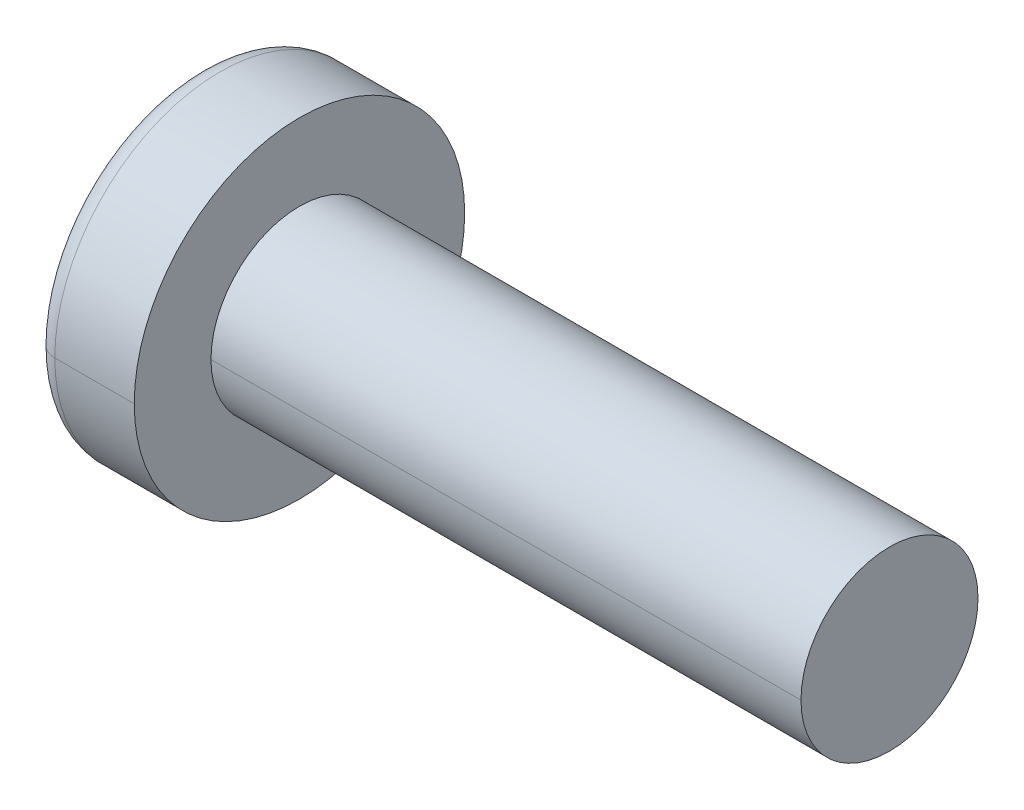
ISO-10303-21;
HEADER;
FILE_DESCRIPTION(('STEP AP214'),'2;1');
FILE_NAME('part.step','',(''),(''),'','','');
FILE_SCHEMA(('AUTOMOTIVE_DESIGN { 1 0 10303 214 1 1 1 1 }'));
ENDSEC;
DATA;
#1=APPLICATION_CONTEXT('core data for automotive mechanical design processes');
#2=APPLICATION_PROTOCOL_DEFINITION('international standard','automotive_design',2000,#1);
#3=PRODUCT_CONTEXT('',#1,'mechanical');
#4=PRODUCT('Part','Part','',(#3));
#5=PRODUCT_RELATED_PRODUCT_CATEGORY('part','',(#4));
#6=PRODUCT_DEFINITION_FORMATION('','',#4);
#7=PRODUCT_DEFINITION_CONTEXT('part definition',#1,'design');
#8=PRODUCT_DEFINITION('design','',#6,#7);
#9=PRODUCT_DEFINITION_SHAPE('','',#8);
#10=(LENGTH_UNIT() NAMED_UNIT(*) SI_UNIT(.MILLI.,.METRE.));
#11=(NAMED_UNIT(*) PLANE_ANGLE_UNIT() SI_UNIT($,.RADIAN.));
#12=(NAMED_UNIT(*) SI_UNIT($,.STERADIAN.) SOLID_ANGLE_UNIT());
#13=UNCERTAINTY_MEASURE_WITH_UNIT(LENGTH_MEASURE(1.E-05),#10,'distance_accuracy_value','');
#14=(GEOMETRIC_REPRESENTATION_CONTEXT(3) GLOBAL_UNCERTAINTY_ASSIGNED_CONTEXT((#13)) GLOBAL_UNIT_ASSIGNED_CONTEXT((#10,
#11,#12)) REPRESENTATION_CONTEXT('',''));
#15=CARTESIAN_POINT('',(0.,0.,0.));
#16=DIRECTION('',(0.,0.,1.));
#17=DIRECTION('',(1.,0.,0.));
#18=AXIS2_PLACEMENT_3D('',#15,#16,#17);
#19=CARTESIAN_POINT('',(1.05335585592012,0.,0.));
#20=DIRECTION('',(-1.,0.,0.));
#21=DIRECTION('',(0.,0.,1.));
#22=AXIS2_PLACEMENT_3D('',#19,#20,#21);
#23=TOROIDAL_SURFACE('',#22,2.44,0.36);
#24=CARTESIAN_POINT('',(1.05335585592012,0.,0.));
#25=DIRECTION('',(-1.,0.,0.));
#26=DIRECTION('',(0.,0.,1.));
#27=AXIS2_PLACEMENT_3D('',#24,#25,#26);
#28=CIRCLE('',#27,2.79999999999986);
#29=CARTESIAN_POINT('',(1.05335585592012,0.,2.79999999999986));
#30=VERTEX_POINT('',#29);
#31=CARTESIAN_POINT('',(1.05335585592012,0.,-2.8));
#32=VERTEX_POINT('',#31);
#33=EDGE_CURVE('E11',#30,#32,#28,.T.);
#34=ORIENTED_EDGE('',*,*,#33,.T.);
#35=CARTESIAN_POINT('',(1.05335585592012,0.,-2.43999999999988));
#36=DIRECTION('',(0.,1.,0.));
#37=DIRECTION('',(0.,0.,1.));
#38=AXIS2_PLACEMENT_3D('',#35,#36,#37);
#39=CIRCLE('',#38,0.36);
#40=CARTESIAN_POINT('',(0.747150706810473,0.,-2.62931034482761));
#41=VERTEX_POINT('',#40);
#42=EDGE_CURVE('E28',#32,#41,#39,.T.);
#43=ORIENTED_EDGE('',*,*,#42,.T.);
#44=CARTESIAN_POINT('',(0.747150706810473,0.,0.));
#45=DIRECTION('',(-1.,0.,0.));
#46=DIRECTION('',(0.,0.,1.));
#47=AXIS2_PLACEMENT_3D('',#44,#45,#46);
#48=CIRCLE('',#47,2.62931034482745);
#49=CARTESIAN_POINT('',(0.747150706810473,2.62931034482726,0.));
#50=VERTEX_POINT('',#49);
#51=EDGE_CURVE('E256',#50,#41,#48,.T.);
#52=ORIENTED_EDGE('',*,*,#51,.F.);
#53=CARTESIAN_POINT('',(0.747150706810473,0.,0.));
#54=DIRECTION('',(-1.,0.,0.));
#55=DIRECTION('',(0.,0.,1.));
#56=AXIS2_PLACEMENT_3D('',#53,#54,#55);
#57=CIRCLE('',#56,2.62931034482745);
#58=CARTESIAN_POINT('',(0.747150706810473,0.,2.62931034482756));
#59=VERTEX_POINT('',#58);
#60=EDGE_CURVE('E174',#59,#50,#57,.T.);
#61=ORIENTED_EDGE('',*,*,#60,.F.);
#62=CARTESIAN_POINT('',(1.05335585592012,0.,2.43999999999988));
#63=DIRECTION('',(0.,-1.,0.));
#64=DIRECTION('',(0.,0.,-1.));
#65=AXIS2_PLACEMENT_3D('',#62,#63,#64);
#66=CIRCLE('',#65,0.36);
#67=EDGE_CURVE('E168',#30,#59,#66,.T.);
#68=ORIENTED_EDGE('',*,*,#67,.F.);
#69=EDGE_LOOP('',(#34,#43,#52,#61,#68));
#70=FACE_BOUND('',#69,.T.);
#71=ADVANCED_FACE('F17',(#70),#23,.T.);
#72=CARTESIAN_POINT('',(-25.4,0.,0.));
#73=DIRECTION('',(-1.,0.,0.));
#74=DIRECTION('',(0.,0.,1.));
#75=AXIS2_PLACEMENT_3D('',#72,#73,#74);
#76=CYLINDRICAL_SURFACE('',#75,2.79999999999986);
#77=CARTESIAN_POINT('',(2.4,0.,0.));
#78=DIRECTION('',(-1.,0.,0.));
#79=DIRECTION('',(0.,0.,1.));
#80=AXIS2_PLACEMENT_3D('',#77,#78,#79);
#81=CIRCLE('',#80,2.79999999999986);
#82=CARTESIAN_POINT('',(2.4,0.,2.79999999999986));
#83=VERTEX_POINT('',#82);
#84=CARTESIAN_POINT('',(2.4,0.,-2.8));
#85=VERTEX_POINT('',#84);
#86=EDGE_CURVE('E291',#83,#85,#81,.T.);
#87=ORIENTED_EDGE('',*,*,#86,.T.);
#88=DIRECTION('',(-1.,0.,0.));
#89=VECTOR('',#88,1.);
#90=CARTESIAN_POINT('',(-25.4,0.,-2.79999999999989));
#91=LINE('',#90,#89);
#92=EDGE_CURVE('E43',#85,#32,#91,.T.);
#93=ORIENTED_EDGE('',*,*,#92,.T.);
#94=ORIENTED_EDGE('',*,*,#33,.F.);
#95=DIRECTION('',(-1.,0.,0.));
#96=VECTOR('',#95,1.);
#97=CARTESIAN_POINT('',(-25.4,0.,2.79999999999984));
#98=LINE('',#97,#96);
#99=EDGE_CURVE('E185',#83,#30,#98,.T.);
#100=ORIENTED_EDGE('',*,*,#99,.F.);
#101=EDGE_LOOP('',(#87,#93,#94,#100));
#102=FACE_BOUND('',#101,.T.);
#103=ADVANCED_FACE('F192',(#102),#76,.T.);
#104=CARTESIAN_POINT('',(-25.4,0.,0.));
#105=DIRECTION('',(-1.,0.,0.));
#106=DIRECTION('',(0.,0.,1.));
#107=AXIS2_PLACEMENT_3D('',#104,#105,#106);
#108=CYLINDRICAL_SURFACE('',#107,1.49999999999993);
#109=CARTESIAN_POINT('',(12.4,0.,0.));
#110=DIRECTION('',(-1.,0.,0.));
#111=DIRECTION('',(0.,0.,1.));
#112=AXIS2_PLACEMENT_3D('',#109,#110,#111);
#113=CIRCLE('',#112,1.49999999999993);
#114=CARTESIAN_POINT('',(12.4,0.,1.49999999999994));
#115=VERTEX_POINT('',#114);
#116=CARTESIAN_POINT('',(12.4,0.,-1.49999999999998));
#117=VERTEX_POINT('',#116);
#118=EDGE_CURVE('E232',#115,#117,#113,.T.);
#119=ORIENTED_EDGE('',*,*,#118,.T.);
#120=DIRECTION('',(-1.,0.,0.));
#121=VECTOR('',#120,1.);
#122=CARTESIAN_POINT('',(-25.4,0.,-1.49999999999995));
#123=LINE('',#122,#121);
#124=CARTESIAN_POINT('',(2.4,0.,-1.5));
#125=VERTEX_POINT('',#124);
#126=EDGE_CURVE('E236',#117,#125,#123,.T.);
#127=ORIENTED_EDGE('',*,*,#126,.T.);
#128=CARTESIAN_POINT('',(2.4,0.,0.));
#129=DIRECTION('',(-1.,0.,0.));
#130=DIRECTION('',(0.,0.,1.));
#131=AXIS2_PLACEMENT_3D('',#128,#129,#130);
#132=CIRCLE('',#131,1.49999999999993);
#133=CARTESIAN_POINT('',(2.4,0.,1.49999999999992));
#134=VERTEX_POINT('',#133);
#135=EDGE_CURVE('E333',#134,#125,#132,.T.);
#136=ORIENTED_EDGE('',*,*,#135,.F.);
#137=DIRECTION('',(-1.,0.,0.));
#138=VECTOR('',#137,1.);
#139=CARTESIAN_POINT('',(-25.4,0.,1.4999999999999));
#140=LINE('',#139,#138);
#141=EDGE_CURVE('E329',#115,#134,#140,.T.);
#142=ORIENTED_EDGE('',*,*,#141,.F.);
#143=EDGE_LOOP('',(#119,#127,#136,#142));
#144=FACE_BOUND('',#143,.T.);
#145=ADVANCED_FACE('F482',(#144),#108,.T.);
#146=CARTESIAN_POINT('',(5.,0.,0.));
#147=DIRECTION('',(1.,0.,0.));
#148=DIRECTION('',(0.,1.,0.));
#149=AXIS2_PLACEMENT_3D('',#146,#147,#148);
#150=SPHERICAL_SURFACE('',#149,5.);
#151=ORIENTED_EDGE('',*,*,#51,.T.);
#152=CARTESIAN_POINT('',(0.747150706810473,0.,0.));
#153=DIRECTION('',(-1.,0.,0.));
#154=DIRECTION('',(0.,0.,1.));
#155=AXIS2_PLACEMENT_3D('',#152,#153,#154);
#156=CIRCLE('',#155,2.62931034482745);
#157=CARTESIAN_POINT('',(0.747150706810473,-2.62931034482743,0.));
#158=VERTEX_POINT('',#157);
#159=EDGE_CURVE('E214',#41,#158,#156,.T.);
#160=ORIENTED_EDGE('',*,*,#159,.T.);
#161=CARTESIAN_POINT('',(5.,0.,0.));
#162=DIRECTION('',(0.,0.,-1.));
#163=DIRECTION('',(0.,1.,0.));
#164=AXIS2_PLACEMENT_3D('',#161,#162,#163);
#165=CIRCLE('',#164,5.);
#166=CARTESIAN_POINT('',(0.177959569922061,-1.3220915591186,0.));
#167=VERTEX_POINT('',#166);
#168=EDGE_CURVE('E210',#158,#167,#165,.T.);
#169=ORIENTED_EDGE('',*,*,#168,.T.);
#170=CARTESIAN_POINT('',(3.98403090792016,1.41352221506753,0.));
#171=DIRECTION('',(0.583636048152556,-0.812015371342727,0.));
#172=DIRECTION('',(0.812015371342727,0.583636048152556,0.));
#173=AXIS2_PLACEMENT_3D('',#170,#171,#172);
#174=CIRCLE('',#173,4.68719124331919);
#175=CARTESIAN_POINT('',(0.188596138461464,-1.31444652548077,-0.35017597408216));
#176=VERTEX_POINT('',#175);
#177=EDGE_CURVE('E215',#167,#176,#174,.T.);
#178=ORIENTED_EDGE('',*,*,#177,.T.);
#179=CARTESIAN_POINT('',(4.98382636322273,0.,0.153868112043296));
#180=DIRECTION('',(-0.104537710696282,0.,0.994520923380891));
#181=DIRECTION('',(0.994520923380891,0.,0.104537710696282));
#182=AXIS2_PLACEMENT_3D('',#179,#180,#181);
#183=CIRCLE('',#182,4.99760572850336);
#184=CARTESIAN_POINT('',(0.0270341343314024,-0.367158343834467,-0.367158343834471));
#185=VERTEX_POINT('',#184);
#186=EDGE_CURVE('E284',#185,#176,#183,.T.);
#187=ORIENTED_EDGE('',*,*,#186,.F.);
#188=CARTESIAN_POINT('',(4.98382636322273,0.153868112043244,0.));
#189=DIRECTION('',(-0.104537710696282,0.994520923380891,0.));
#190=DIRECTION('',(-0.994520923380891,-0.104537710696282,0.));
#191=AXIS2_PLACEMENT_3D('',#188,#189,#190);
#192=CIRCLE('',#191,4.99760572850336);
#193=CARTESIAN_POINT('',(0.188596138461603,-0.350175974082205,-1.31444652548067));
#194=VERTEX_POINT('',#193);
#195=EDGE_CURVE('E73',#194,#185,#192,.T.);
#196=ORIENTED_EDGE('',*,*,#195,.F.);
#197=CARTESIAN_POINT('',(3.98403090792012,0.,1.41352221506755));
#198=DIRECTION('',(0.583636048152557,0.,-0.812015371342727));
#199=DIRECTION('',(-0.812015371342727,0.,-0.583636048152557));
#200=AXIS2_PLACEMENT_3D('',#197,#198,#199);
#201=CIRCLE('',#200,4.68719124331919);
#202=CARTESIAN_POINT('',(0.188596138461603,0.350175974082108,-1.31444652548074));
#203=VERTEX_POINT('',#202);
#204=EDGE_CURVE('E216',#194,#203,#201,.T.);
#205=ORIENTED_EDGE('',*,*,#204,.T.);
#206=CARTESIAN_POINT('',(4.98382636322273,-0.153868112043341,0.));
#207=DIRECTION('',(-0.104537710696282,-0.994520923380891,0.));
#208=DIRECTION('',(0.994520923380891,-0.104537710696282,0.));
#209=AXIS2_PLACEMENT_3D('',#206,#207,#208);
#210=CIRCLE('',#209,4.99760572850336);
#211=CARTESIAN_POINT('',(0.0270341343313607,0.367158343834447,-0.367158343834478));
#212=VERTEX_POINT('',#211);
#213=EDGE_CURVE('E89',#212,#203,#210,.T.);
#214=ORIENTED_EDGE('',*,*,#213,.F.);
#215=CARTESIAN_POINT('',(4.98382636322273,0.,0.153868112043296));
#216=DIRECTION('',(-0.104537710696282,0.,0.994520923380891));
#217=DIRECTION('',(0.994520923380891,0.,0.104537710696282));
#218=AXIS2_PLACEMENT_3D('',#215,#216,#217);
#219=CIRCLE('',#218,4.99760572850336);
#220=CARTESIAN_POINT('',(0.188596138461533,1.31444652548068,-0.350175974082184));
#221=VERTEX_POINT('',#220);
#222=EDGE_CURVE('E225',#221,#212,#219,.T.);
#223=ORIENTED_EDGE('',*,*,#222,.F.);
#224=CARTESIAN_POINT('',(3.98403090792016,-1.41352221506765,0.));
#225=DIRECTION('',(0.583636048152557,0.812015371342727,0.));
#226=DIRECTION('',(-0.812015371342727,0.583636048152557,0.));
#227=AXIS2_PLACEMENT_3D('',#224,#225,#226);
#228=CIRCLE('',#227,4.68719124331919);
#229=CARTESIAN_POINT('',(0.177959569922067,1.32209155911848,0.));
#230=VERTEX_POINT('',#229);
#231=EDGE_CURVE('E219',#221,#230,#228,.T.);
#232=ORIENTED_EDGE('',*,*,#231,.T.);
#233=CARTESIAN_POINT('',(5.,0.,0.));
#234=DIRECTION('',(0.,0.,1.));
#235=DIRECTION('',(0.,-1.,0.));
#236=AXIS2_PLACEMENT_3D('',#233,#234,#235);
#237=CIRCLE('',#236,5.);
#238=EDGE_CURVE('E280',#50,#230,#237,.T.);
#239=ORIENTED_EDGE('',*,*,#238,.F.);
#240=EDGE_LOOP('',(#151,#160,#169,#178,#187,#196,#205,#214,#223,#232,#239));
#241=FACE_BOUND('',#240,.T.);
#242=ADVANCED_FACE('F477',(#241),#150,.T.);
#243=CARTESIAN_POINT('',(5.,0.,0.));
#244=DIRECTION('',(1.,0.,0.));
#245=DIRECTION('',(0.,1.,0.));
#246=AXIS2_PLACEMENT_3D('',#243,#244,#245);
#247=SPHERICAL_SURFACE('',#246,5.);
#248=ORIENTED_EDGE('',*,*,#168,.F.);
#249=CARTESIAN_POINT('',(0.747150706810473,0.,0.));
#250=DIRECTION('',(-1.,0.,0.));
#251=DIRECTION('',(0.,0.,1.));
#252=AXIS2_PLACEMENT_3D('',#249,#250,#251);
#253=CIRCLE('',#252,2.62931034482745);
#254=EDGE_CURVE('E279',#158,#59,#253,.T.);
#255=ORIENTED_EDGE('',*,*,#254,.T.);
#256=ORIENTED_EDGE('',*,*,#60,.T.);
#257=ORIENTED_EDGE('',*,*,#238,.T.);
#258=CARTESIAN_POINT('',(3.98403090792016,-1.41352221506765,0.));
#259=DIRECTION('',(0.583636048152557,0.812015371342727,0.));
#260=DIRECTION('',(-0.812015371342727,0.583636048152557,0.));
#261=AXIS2_PLACEMENT_3D('',#258,#259,#260);
#262=CIRCLE('',#261,4.68719124331919);
#263=CARTESIAN_POINT('',(0.188596138461533,1.31444652548072,0.350175974082132));
#264=VERTEX_POINT('',#263);
#265=EDGE_CURVE('E240',#230,#264,#262,.T.);
#266=ORIENTED_EDGE('',*,*,#265,.T.);
#267=CARTESIAN_POINT('',(4.98382636322273,0.,-0.153868112043303));
#268=DIRECTION('',(-0.104537710696282,0.,-0.994520923380891));
#269=DIRECTION('',(-0.994520923380891,0.,0.104537710696282));
#270=AXIS2_PLACEMENT_3D('',#267,#268,#269);
#271=CIRCLE('',#270,4.99760572850336);
#272=CARTESIAN_POINT('',(0.0270341343313607,0.367158343834488,0.367158343834436));
#273=VERTEX_POINT('',#272);
#274=EDGE_CURVE('E231',#273,#264,#271,.T.);
#275=ORIENTED_EDGE('',*,*,#274,.F.);
#276=CARTESIAN_POINT('',(4.98382636322273,-0.153868112043341,0.));
#277=DIRECTION('',(-0.104537710696282,-0.994520923380891,0.));
#278=DIRECTION('',(0.994520923380891,-0.104537710696282,0.));
#279=AXIS2_PLACEMENT_3D('',#276,#277,#278);
#280=CIRCLE('',#279,4.99760572850336);
#281=CARTESIAN_POINT('',(0.188596138461492,0.350175974082121,1.31444652548072));
#282=VERTEX_POINT('',#281);
#283=EDGE_CURVE('E262',#282,#273,#280,.T.);
#284=ORIENTED_EDGE('',*,*,#283,.F.);
#285=CARTESIAN_POINT('',(3.9840309079202,0.,-1.41352221506756));
#286=DIRECTION('',(0.583636048152557,0.,0.812015371342727));
#287=DIRECTION('',(0.812015371342727,0.,-0.583636048152557));
#288=AXIS2_PLACEMENT_3D('',#285,#286,#287);
#289=CIRCLE('',#288,4.68719124331919);
#290=CARTESIAN_POINT('',(0.188596138461492,-0.35017597408215,1.31444652548067));
#291=VERTEX_POINT('',#290);
#292=EDGE_CURVE('E224',#282,#291,#289,.T.);
#293=ORIENTED_EDGE('',*,*,#292,.T.);
#294=CARTESIAN_POINT('',(4.98382636322273,0.153868112043244,0.));
#295=DIRECTION('',(-0.104537710696282,0.994520923380891,0.));
#296=DIRECTION('',(-0.994520923380891,-0.104537710696282,0.));
#297=AXIS2_PLACEMENT_3D('',#294,#295,#296);
#298=CIRCLE('',#297,4.99760572850336);
#299=CARTESIAN_POINT('',(0.0270341343313607,-0.367158343834495,0.367158343834492));
#300=VERTEX_POINT('',#299);
#301=EDGE_CURVE('E266',#300,#291,#298,.T.);
#302=ORIENTED_EDGE('',*,*,#301,.F.);
#303=CARTESIAN_POINT('',(4.98382636322273,0.,-0.153868112043303));
#304=DIRECTION('',(-0.104537710696282,0.,-0.994520923380891));
#305=DIRECTION('',(-0.994520923380891,0.,0.104537710696282));
#306=AXIS2_PLACEMENT_3D('',#303,#304,#305);
#307=CIRCLE('',#306,4.99760572850336);
#308=CARTESIAN_POINT('',(0.188596138461603,-1.31444652548075,0.350175974082163));
#309=VERTEX_POINT('',#308);
#310=EDGE_CURVE('E267',#309,#300,#307,.T.);
#311=ORIENTED_EDGE('',*,*,#310,.F.);
#312=CARTESIAN_POINT('',(3.98403090792016,1.41352221506753,0.));
#313=DIRECTION('',(0.583636048152556,-0.812015371342727,0.));
#314=DIRECTION('',(0.812015371342727,0.583636048152556,0.));
#315=AXIS2_PLACEMENT_3D('',#312,#313,#314);
#316=CIRCLE('',#315,4.68719124331919);
#317=EDGE_CURVE('E220',#309,#167,#316,.T.);
#318=ORIENTED_EDGE('',*,*,#317,.T.);
#319=EDGE_LOOP('',(#248,#255,#256,#257,#266,#275,#284,#293,#302,#311,#318));
#320=FACE_BOUND('',#319,.T.);
#321=ADVANCED_FACE('F393',(#320),#247,.T.);
#322=CARTESIAN_POINT('',(2.01739130434783,0.,-0.15794466403167));
#323=DIRECTION('',(-0.104537710696282,0.,0.994520923380891));
#324=DIRECTION('',(0.,1.,0.));
#325=AXIS2_PLACEMENT_3D('',#322,#323,#324);
#326=PLANE('',#325);
#327=ORIENTED_EDGE('',*,*,#222,.T.);
#328=DIRECTION('',(0.989130931836556,-0.103971149085088,0.103971149085087));
#329=VECTOR('',#328,1.);
#330=CARTESIAN_POINT('',(2.03363450411051,0.156237282238327,-0.156237282238358));
#331=LINE('',#330,#329);
#332=CARTESIAN_POINT('',(1.76,0.184999999999963,-0.184999999999966));
#333=VERTEX_POINT('',#332);
#334=EDGE_CURVE('E241',#212,#333,#331,.T.);
#335=ORIENTED_EDGE('',*,*,#334,.T.);
#336=DIRECTION('',(0.809073553388544,-0.581521616497988,0.0850446632823144));
#337=VECTOR('',#336,1.);
#338=CARTESIAN_POINT('',(0.,1.4499999999999,-0.369999999999985));
#339=LINE('',#338,#337);
#340=EDGE_CURVE('E181',#221,#333,#339,.T.);
#341=ORIENTED_EDGE('',*,*,#340,.F.);
#342=EDGE_LOOP('',(#327,#335,#341));
#343=FACE_BOUND('',#342,.T.);
#344=ADVANCED_FACE('F19',(#343),#326,.T.);
#345=CARTESIAN_POINT('',(2.01739130434783,0.,-0.15794466403167));
#346=DIRECTION('',(-0.104537710696282,0.,0.994520923380891));
#347=DIRECTION('',(0.,1.,0.));
#348=AXIS2_PLACEMENT_3D('',#345,#346,#347);
#349=PLANE('',#348);
#350=DIRECTION('',(0.809073553388543,0.581521616497989,0.0850446632823141));
#351=VECTOR('',#350,1.);
#352=CARTESIAN_POINT('',(0.,-1.45,-0.369999999999978));
#353=LINE('',#352,#351);
#354=CARTESIAN_POINT('',(1.76000000000006,-0.184999999999997,-0.184999999999988));
#355=VERTEX_POINT('',#354);
#356=EDGE_CURVE('E245',#176,#355,#353,.T.);
#357=ORIENTED_EDGE('',*,*,#356,.T.);
#358=DIRECTION('',(-0.989130931836556,-0.103971149085087,-0.103971149085087));
#359=VECTOR('',#358,1.);
#360=CARTESIAN_POINT('',(2.03363450411055,-0.156237282238437,-0.156237282238403));
#361=LINE('',#360,#359);
#362=EDGE_CURVE('E21',#355,#185,#361,.T.);
#363=ORIENTED_EDGE('',*,*,#362,.T.);
#364=ORIENTED_EDGE('',*,*,#186,.T.);
#365=EDGE_LOOP('',(#357,#363,#364));
#366=FACE_BOUND('',#365,.T.);
#367=ADVANCED_FACE('F392',(#366),#349,.T.);
#368=CARTESIAN_POINT('',(2.01739130434783,0.,0.157944664031625));
#369=DIRECTION('',(-0.104537710696282,0.,-0.994520923380891));
#370=DIRECTION('',(-0.994520923380891,0.,0.104537710696282));
#371=AXIS2_PLACEMENT_3D('',#368,#369,#370);
#372=PLANE('',#371);
#373=DIRECTION('',(0.809073553388544,-0.581521616497988,-0.0850446632823142));
#374=VECTOR('',#373,1.);
#375=CARTESIAN_POINT('',(0.,1.44999999999987,0.36999999999995));
#376=LINE('',#375,#374);
#377=CARTESIAN_POINT('',(1.76,0.184999999999977,0.184999999999994));
#378=VERTEX_POINT('',#377);
#379=EDGE_CURVE('E230',#264,#378,#376,.T.);
#380=ORIENTED_EDGE('',*,*,#379,.T.);
#381=DIRECTION('',(-0.989130931836556,0.103971149085087,0.103971149085087));
#382=VECTOR('',#381,1.);
#383=CARTESIAN_POINT('',(2.03363450411051,0.156237282238396,0.156237282238371));
#384=LINE('',#383,#382);
#385=EDGE_CURVE('E226',#378,#273,#384,.T.);
#386=ORIENTED_EDGE('',*,*,#385,.T.);
#387=ORIENTED_EDGE('',*,*,#274,.T.);
#388=EDGE_LOOP('',(#380,#386,#387));
#389=FACE_BOUND('',#388,.T.);
#390=ADVANCED_FACE('F428',(#389),#372,.T.);
#391=CARTESIAN_POINT('',(2.01739130434783,0.,0.157944664031625));
#392=DIRECTION('',(-0.104537710696282,0.,-0.994520923380891));
#393=DIRECTION('',(-0.994520923380891,0.,0.104537710696282));
#394=AXIS2_PLACEMENT_3D('',#391,#392,#393);
#395=PLANE('',#394);
#396=ORIENTED_EDGE('',*,*,#310,.T.);
#397=DIRECTION('',(0.989130931836556,0.103971149085088,-0.103971149085087));
#398=VECTOR('',#397,1.);
#399=CARTESIAN_POINT('',(2.03363450411047,-0.156237282238424,0.156237282238348));
#400=LINE('',#399,#398);
#401=CARTESIAN_POINT('',(1.75999999999997,-0.18499999999997,0.185000000000032));
#402=VERTEX_POINT('',#401);
#403=EDGE_CURVE('E271',#300,#402,#400,.T.);
#404=ORIENTED_EDGE('',*,*,#403,.T.);
#405=DIRECTION('',(0.809073553388544,0.581521616497988,-0.0850446632823145));
#406=VECTOR('',#405,1.);
#407=CARTESIAN_POINT('',(0.,-1.44999999999998,0.369999999999995));
#408=LINE('',#407,#406);
#409=EDGE_CURVE('E203',#309,#402,#408,.T.);
#410=ORIENTED_EDGE('',*,*,#409,.F.);
#411=EDGE_LOOP('',(#396,#404,#410));
#412=FACE_BOUND('',#411,.T.);
#413=ADVANCED_FACE('F369',(#412),#395,.T.);
#414=CARTESIAN_POINT('',(-25.4,0.,0.));
#415=DIRECTION('',(-1.,0.,0.));
#416=DIRECTION('',(0.,0.,1.));
#417=AXIS2_PLACEMENT_3D('',#414,#415,#416);
#418=CYLINDRICAL_SURFACE('',#417,1.49999999999993);
#419=ORIENTED_EDGE('',*,*,#126,.F.);
#420=CARTESIAN_POINT('',(12.4,0.,0.));
#421=DIRECTION('',(-1.,0.,0.));
#422=DIRECTION('',(0.,0.,1.));
#423=AXIS2_PLACEMENT_3D('',#420,#421,#422);
#424=CIRCLE('',#423,1.49999999999993);
#425=EDGE_CURVE('E328',#117,#115,#424,.T.);
#426=ORIENTED_EDGE('',*,*,#425,.T.);
#427=ORIENTED_EDGE('',*,*,#141,.T.);
#428=CARTESIAN_POINT('',(2.4,0.,0.));
#429=DIRECTION('',(-1.,0.,0.));
#430=DIRECTION('',(0.,0.,1.));
#431=AXIS2_PLACEMENT_3D('',#428,#429,#430);
#432=CIRCLE('',#431,1.49999999999993);
#433=EDGE_CURVE('E343',#125,#134,#432,.T.);
#434=ORIENTED_EDGE('',*,*,#433,.F.);
#435=EDGE_LOOP('',(#419,#426,#427,#434));
#436=FACE_BOUND('',#435,.T.);
#437=ADVANCED_FACE('F498',(#436),#418,.T.);
#438=CARTESIAN_POINT('',(2.4,1.49999999999985,0.));
#439=DIRECTION('',(-1.,0.,0.));
#440=DIRECTION('',(0.,0.,1.));
#441=AXIS2_PLACEMENT_3D('',#438,#439,#440);
#442=PLANE('',#441);
#443=ORIENTED_EDGE('',*,*,#86,.F.);
#444=CARTESIAN_POINT('',(2.4,0.,0.));
#445=DIRECTION('',(-1.,0.,0.));
#446=DIRECTION('',(0.,0.,1.));
#447=AXIS2_PLACEMENT_3D('',#444,#445,#446);
#448=CIRCLE('',#447,2.79999999999986);
#449=EDGE_CURVE('E188',#85,#83,#448,.T.);
#450=ORIENTED_EDGE('',*,*,#449,.F.);
#451=EDGE_LOOP('',(#443,#450));
#452=FACE_BOUND('',#451,.T.);
#453=ORIENTED_EDGE('',*,*,#135,.T.);
#454=ORIENTED_EDGE('',*,*,#433,.T.);
#455=EDGE_LOOP('',(#453,#454));
#456=FACE_BOUND('',#455,.T.);
#457=ADVANCED_FACE('F503',(#452,#456),#442,.F.);
#458=CARTESIAN_POINT('',(-25.4,0.,0.));
#459=DIRECTION('',(-1.,0.,0.));
#460=DIRECTION('',(0.,0.,1.));
#461=AXIS2_PLACEMENT_3D('',#458,#459,#460);
#462=CYLINDRICAL_SURFACE('',#461,2.79999999999986);
#463=ORIENTED_EDGE('',*,*,#92,.F.);
#464=ORIENTED_EDGE('',*,*,#449,.T.);
#465=ORIENTED_EDGE('',*,*,#99,.T.);
#466=CARTESIAN_POINT('',(1.05335585592012,0.,0.));
#467=DIRECTION('',(-1.,0.,0.));
#468=DIRECTION('',(0.,0.,1.));
#469=AXIS2_PLACEMENT_3D('',#466,#467,#468);
#470=CIRCLE('',#469,2.79999999999986);
#471=EDGE_CURVE('E180',#32,#30,#470,.T.);
#472=ORIENTED_EDGE('',*,*,#471,.F.);
#473=EDGE_LOOP('',(#463,#464,#465,#472));
#474=FACE_BOUND('',#473,.T.);
#475=ADVANCED_FACE('F186',(#474),#462,.T.);
#476=CARTESIAN_POINT('',(1.05335585592012,0.,0.));
#477=DIRECTION('',(-1.,0.,0.));
#478=DIRECTION('',(0.,0.,1.));
#479=AXIS2_PLACEMENT_3D('',#476,#477,#478);
#480=TOROIDAL_SURFACE('',#479,2.44,0.36);
#481=ORIENTED_EDGE('',*,*,#42,.F.);
#482=ORIENTED_EDGE('',*,*,#471,.T.);
#483=ORIENTED_EDGE('',*,*,#67,.T.);
#484=ORIENTED_EDGE('',*,*,#254,.F.);
#485=ORIENTED_EDGE('',*,*,#159,.F.);
#486=EDGE_LOOP('',(#481,#482,#483,#484,#485));
#487=FACE_BOUND('',#486,.T.);
#488=ADVANCED_FACE('F193',(#487),#480,.T.);
#489=CARTESIAN_POINT('',(12.4,1.49999999999987,0.));
#490=DIRECTION('',(1.,0.,0.));
#491=DIRECTION('',(0.,-1.,0.));
#492=AXIS2_PLACEMENT_3D('',#489,#490,#491);
#493=PLANE('',#492);
#494=ORIENTED_EDGE('',*,*,#118,.F.);
#495=ORIENTED_EDGE('',*,*,#425,.F.);
#496=EDGE_LOOP('',(#494,#495));
#497=FACE_BOUND('',#496,.T.);
#498=ADVANCED_FACE('F411',(#497),#493,.T.);
#499=CARTESIAN_POINT('',(1.76,0.184999999999977,0.184999999999994));
#500=DIRECTION('',(0.583636048152557,0.812015371342727,0.));
#501=DIRECTION('',(0.,0.,-1.));
#502=AXIS2_PLACEMENT_3D('',#499,#500,#501);
#503=PLANE('',#502);
#504=ORIENTED_EDGE('',*,*,#340,.T.);
#505=DIRECTION('',(0.,0.,-1.));
#506=VECTOR('',#505,1.);
#507=CARTESIAN_POINT('',(1.76,0.184999999999977,0.184999999999994));
#508=LINE('',#507,#506);
#509=EDGE_CURVE('E208',#378,#333,#508,.T.);
#510=ORIENTED_EDGE('',*,*,#509,.F.);
#511=ORIENTED_EDGE('',*,*,#379,.F.);
#512=ORIENTED_EDGE('',*,*,#265,.F.);
#513=ORIENTED_EDGE('',*,*,#231,.F.);
#514=EDGE_LOOP('',(#504,#510,#511,#512,#513));
#515=FACE_BOUND('',#514,.T.);
#516=ADVANCED_FACE('F416',(#515),#503,.F.);
#517=CARTESIAN_POINT('',(1.76000000000006,-0.184999999999997,-0.184999999999988));
#518=DIRECTION('',(0.583636048152556,-0.812015371342727,0.));
#519=DIRECTION('',(0.,0.,-1.));
#520=AXIS2_PLACEMENT_3D('',#517,#518,#519);
#521=PLANE('',#520);
#522=ORIENTED_EDGE('',*,*,#409,.T.);
#523=DIRECTION('',(0.,0.,1.));
#524=VECTOR('',#523,1.);
#525=CARTESIAN_POINT('',(1.76000000000006,-0.184999999999997,-0.184999999999988));
#526=LINE('',#525,#524);
#527=EDGE_CURVE('E288',#355,#402,#526,.T.);
#528=ORIENTED_EDGE('',*,*,#527,.F.);
#529=ORIENTED_EDGE('',*,*,#356,.F.);
#530=ORIENTED_EDGE('',*,*,#177,.F.);
#531=ORIENTED_EDGE('',*,*,#317,.F.);
#532=EDGE_LOOP('',(#522,#528,#529,#530,#531));
#533=FACE_BOUND('',#532,.T.);
#534=ADVANCED_FACE('F366',(#533),#521,.F.);
#535=CARTESIAN_POINT('',(1.76,0.184999999999963,-0.184999999999966));
#536=DIRECTION('',(-1.,0.,0.));
#537=DIRECTION('',(0.,0.,1.));
#538=AXIS2_PLACEMENT_3D('',#535,#536,#537);
#539=PLANE('',#538);
#540=DIRECTION('',(0.,1.,0.));
#541=VECTOR('',#540,1.);
#542=CARTESIAN_POINT('',(1.76000000000006,-0.184999999999997,-0.184999999999988));
#543=LINE('',#542,#541);
#544=EDGE_CURVE('E209',#355,#333,#543,.T.);
#545=ORIENTED_EDGE('',*,*,#544,.F.);
#546=ORIENTED_EDGE('',*,*,#527,.T.);
#547=DIRECTION('',(0.,-1.,0.));
#548=VECTOR('',#547,1.);
#549=CARTESIAN_POINT('',(1.76,0.184999999999977,0.184999999999994));
#550=LINE('',#549,#548);
#551=EDGE_CURVE('E265',#378,#402,#550,.T.);
#552=ORIENTED_EDGE('',*,*,#551,.F.);
#553=ORIENTED_EDGE('',*,*,#509,.T.);
#554=EDGE_LOOP('',(#545,#546,#552,#553));
#555=FACE_BOUND('',#554,.T.);
#556=ADVANCED_FACE('F541',(#555),#539,.T.);
#557=CARTESIAN_POINT('',(1.76,0.184999999999963,-0.184999999999966));
#558=DIRECTION('',(0.583636048152557,0.,-0.812015371342727));
#559=DIRECTION('',(0.,-1.,0.));
#560=AXIS2_PLACEMENT_3D('',#557,#558,#559);
#561=PLANE('',#560);
#562=DIRECTION('',(0.809073553388544,0.0850446632823122,0.581521616497989));
#563=VECTOR('',#562,1.);
#564=CARTESIAN_POINT('',(0.,-0.369999999999975,-1.44999999999992));
#565=LINE('',#564,#563);
#566=EDGE_CURVE('E205',#194,#355,#565,.T.);
#567=ORIENTED_EDGE('',*,*,#566,.T.);
#568=ORIENTED_EDGE('',*,*,#544,.T.);
#569=DIRECTION('',(0.809073553388544,-0.0850446632823165,0.581521616497988));
#570=VECTOR('',#569,1.);
#571=CARTESIAN_POINT('',(0.,0.369999999999905,-1.44999999999995));
#572=LINE('',#571,#570);
#573=EDGE_CURVE('E246',#203,#333,#572,.T.);
#574=ORIENTED_EDGE('',*,*,#573,.F.);
#575=ORIENTED_EDGE('',*,*,#204,.F.);
#576=EDGE_LOOP('',(#567,#568,#574,#575));
#577=FACE_BOUND('',#576,.T.);
#578=ADVANCED_FACE('F533',(#577),#561,.F.);
#579=CARTESIAN_POINT('',(2.01739130434783,-0.15794466403165,0.));
#580=DIRECTION('',(-0.104537710696282,0.994520923380891,0.));
#581=DIRECTION('',(0.,0.,1.));
#582=AXIS2_PLACEMENT_3D('',#579,#580,#581);
#583=PLANE('',#582);
#584=ORIENTED_EDGE('',*,*,#195,.T.);
#585=ORIENTED_EDGE('',*,*,#362,.F.);
#586=ORIENTED_EDGE('',*,*,#566,.F.);
#587=EDGE_LOOP('',(#584,#585,#586));
#588=FACE_BOUND('',#587,.T.);
#589=ADVANCED_FACE('F470',(#588),#583,.T.);
#590=CARTESIAN_POINT('',(2.01739130434783,0.157944664031566,0.));
#591=DIRECTION('',(-0.104537710696282,-0.994520923380891,0.));
#592=DIRECTION('',(-0.994520923380891,0.104537710696282,0.));
#593=AXIS2_PLACEMENT_3D('',#590,#591,#592);
#594=PLANE('',#593);
#595=ORIENTED_EDGE('',*,*,#213,.T.);
#596=ORIENTED_EDGE('',*,*,#573,.T.);
#597=ORIENTED_EDGE('',*,*,#334,.F.);
#598=EDGE_LOOP('',(#595,#596,#597));
#599=FACE_BOUND('',#598,.T.);
#600=ADVANCED_FACE('F460',(#599),#594,.T.);
#601=CARTESIAN_POINT('',(1.75999999999997,-0.18499999999997,0.185000000000032));
#602=DIRECTION('',(0.583636048152557,0.,0.812015371342727));
#603=DIRECTION('',(0.,-1.,0.));
#604=AXIS2_PLACEMENT_3D('',#601,#602,#603);
#605=PLANE('',#604);
#606=DIRECTION('',(0.809073553388544,-0.0850446632823124,-0.581521616497989));
#607=VECTOR('',#606,1.);
#608=CARTESIAN_POINT('',(0.,0.369999999999919,1.44999999999991));
#609=LINE('',#608,#607);
#610=EDGE_CURVE('E249',#282,#378,#609,.T.);
#611=ORIENTED_EDGE('',*,*,#610,.T.);
#612=ORIENTED_EDGE('',*,*,#551,.T.);
#613=DIRECTION('',(0.809073553388544,0.0850446632823171,-0.581521616497987));
#614=VECTOR('',#613,1.);
#615=CARTESIAN_POINT('',(0.,-0.369999999999995,1.4499999999999));
#616=LINE('',#615,#614);
#617=EDGE_CURVE('E297',#291,#402,#616,.T.);
#618=ORIENTED_EDGE('',*,*,#617,.F.);
#619=ORIENTED_EDGE('',*,*,#292,.F.);
#620=EDGE_LOOP('',(#611,#612,#618,#619));
#621=FACE_BOUND('',#620,.T.);
#622=ADVANCED_FACE('F375',(#621),#605,.F.);
#623=CARTESIAN_POINT('',(2.01739130434783,0.157944664031566,0.));
#624=DIRECTION('',(-0.104537710696282,-0.994520923380891,0.));
#625=DIRECTION('',(-0.994520923380891,0.104537710696282,0.));
#626=AXIS2_PLACEMENT_3D('',#623,#624,#625);
#627=PLANE('',#626);
#628=ORIENTED_EDGE('',*,*,#283,.T.);
#629=ORIENTED_EDGE('',*,*,#385,.F.);
#630=ORIENTED_EDGE('',*,*,#610,.F.);
#631=EDGE_LOOP('',(#628,#629,#630));
#632=FACE_BOUND('',#631,.T.);
#633=ADVANCED_FACE('F444',(#632),#627,.T.);
#634=CARTESIAN_POINT('',(2.01739130434783,-0.15794466403165,0.));
#635=DIRECTION('',(-0.104537710696282,0.994520923380891,0.));
#636=DIRECTION('',(0.,0.,1.));
#637=AXIS2_PLACEMENT_3D('',#634,#635,#636);
#638=PLANE('',#637);
#639=ORIENTED_EDGE('',*,*,#301,.T.);
#640=ORIENTED_EDGE('',*,*,#617,.T.);
#641=ORIENTED_EDGE('',*,*,#403,.F.);
#642=EDGE_LOOP('',(#639,#640,#641));
#643=FACE_BOUND('',#642,.T.);
#644=ADVANCED_FACE('F372',(#643),#638,.T.);
#645=CLOSED_SHELL('',(#71,#103,#145,#242,#321,#344,#367,#390,#413,#437,#457,#475,#488,#498,#516,
#534,#556,#578,#589,#600,#622,#633,#644));
#646=MANIFOLD_SOLID_BREP('B1',#645);
#647=ADVANCED_BREP_SHAPE_REPRESENTATION('',(#18,#646),#14);
#648=SHAPE_DEFINITION_REPRESENTATION(#9,#647);
ENDSEC;
END-ISO-10303-21;
